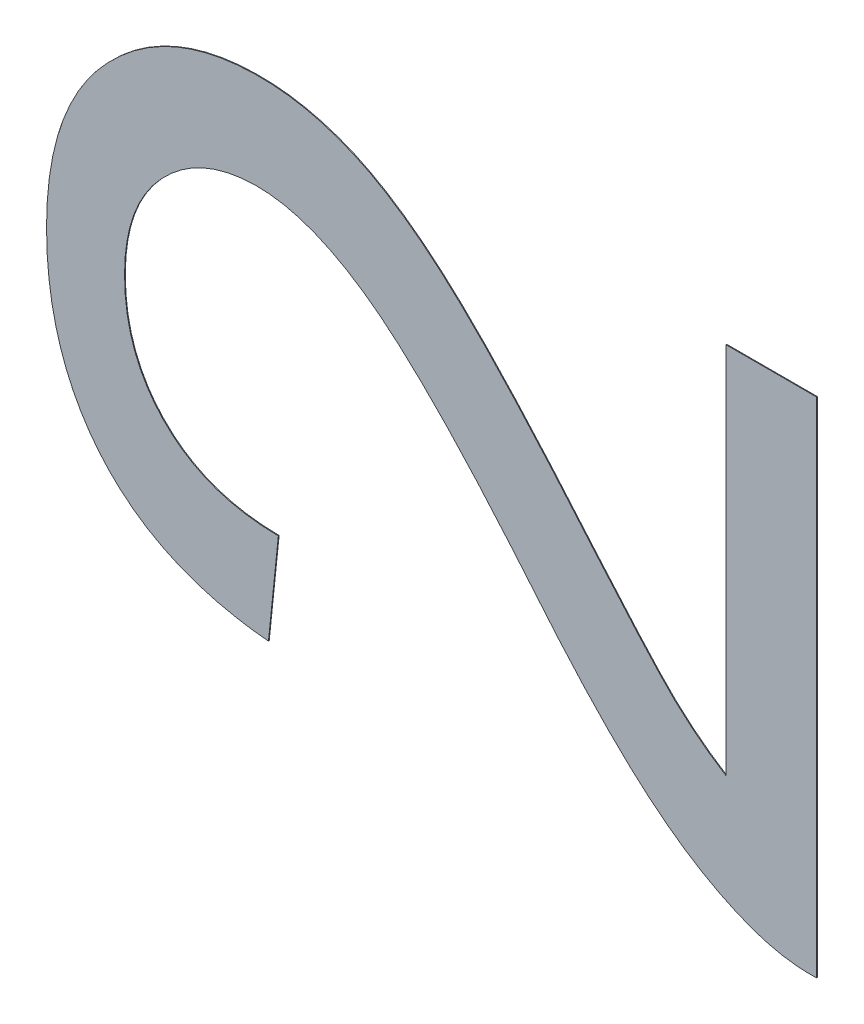
ISO-10303-21;
HEADER;
FILE_DESCRIPTION(('STEP AP214'),'2;1');
FILE_NAME('part.step','',(''),(''),'','','');
FILE_SCHEMA(('AUTOMOTIVE_DESIGN { 1 0 10303 214 1 1 1 1 }'));
ENDSEC;
DATA;
#1=APPLICATION_CONTEXT('core data for automotive mechanical design processes');
#2=APPLICATION_PROTOCOL_DEFINITION('international standard','automotive_design',2000,#1);
#3=PRODUCT_CONTEXT('',#1,'mechanical');
#4=PRODUCT('Part','Part','',(#3));
#5=PRODUCT_RELATED_PRODUCT_CATEGORY('part','',(#4));
#6=PRODUCT_DEFINITION_FORMATION('','',#4);
#7=PRODUCT_DEFINITION_CONTEXT('part definition',#1,'design');
#8=PRODUCT_DEFINITION('design','',#6,#7);
#9=PRODUCT_DEFINITION_SHAPE('','',#8);
#10=(LENGTH_UNIT() NAMED_UNIT(*) SI_UNIT(.MILLI.,.METRE.));
#11=(NAMED_UNIT(*) PLANE_ANGLE_UNIT() SI_UNIT($,.RADIAN.));
#12=(NAMED_UNIT(*) SI_UNIT($,.STERADIAN.) SOLID_ANGLE_UNIT());
#13=UNCERTAINTY_MEASURE_WITH_UNIT(LENGTH_MEASURE(1.E-05),#10,'distance_accuracy_value','');
#14=(GEOMETRIC_REPRESENTATION_CONTEXT(3) GLOBAL_UNCERTAINTY_ASSIGNED_CONTEXT((#13)) GLOBAL_UNIT_ASSIGNED_CONTEXT((#10,
#11,#12)) REPRESENTATION_CONTEXT('',''));
#15=CARTESIAN_POINT('',(0.,0.,0.));
#16=DIRECTION('',(0.,0.,1.));
#17=DIRECTION('',(1.,0.,0.));
#18=AXIS2_PLACEMENT_3D('',#15,#16,#17);
#19=CARTESIAN_POINT('',(51.3,-10.4208269027699,0.002));
#20=DIRECTION('',(0.,-1.,0.));
#21=DIRECTION('',(0.,0.,-1.));
#22=AXIS2_PLACEMENT_3D('',#19,#20,#21);
#23=PLANE('',#22);
#24=CARTESIAN_POINT('',(51.3,-10.4208269027699,0.));
#25=CARTESIAN_POINT('',(51.2212877702749,-10.4208269027699,0.));
#26=CARTESIAN_POINT('',(51.1425755405497,-10.4208269027699,0.));
#27=CARTESIAN_POINT('',(51.0638633108246,-10.4208269027699,0.));
#28=B_SPLINE_CURVE_WITH_KNOTS('',3,(#24,#25,#26,#27),.UNSPECIFIED.,.F.,.F.,(4,4),(0.,
0.0197301457673929),.UNSPECIFIED.);
#29=CARTESIAN_POINT('',(51.3,-10.4208269027699,0.));
#30=VERTEX_POINT('',#29);
#31=CARTESIAN_POINT('',(51.0638633108246,-10.4208269027699,0.));
#32=VERTEX_POINT('',#31);
#33=EDGE_CURVE('E84',#30,#32,#28,.T.);
#34=ORIENTED_EDGE('',*,*,#33,.T.);
#35=DIRECTION('',(0.,0.,-1.));
#36=VECTOR('',#35,1.);
#37=CARTESIAN_POINT('',(51.0638633108246,-10.4208269027699,0.002));
#38=LINE('',#37,#36);
#39=CARTESIAN_POINT('',(51.0638633108246,-10.4208269027699,0.002));
#40=VERTEX_POINT('',#39);
#41=EDGE_CURVE('E93',#40,#32,#38,.T.);
#42=ORIENTED_EDGE('',*,*,#41,.F.);
#43=CARTESIAN_POINT('',(51.3,-10.4208269027699,0.002));
#44=CARTESIAN_POINT('',(51.2212877702749,-10.4208269027699,0.002));
#45=CARTESIAN_POINT('',(51.1425755405497,-10.4208269027699,0.002));
#46=CARTESIAN_POINT('',(51.0638633108246,-10.4208269027699,0.002));
#47=B_SPLINE_CURVE_WITH_KNOTS('',3,(#43,#44,#45,#46),.UNSPECIFIED.,.F.,.F.,(4,4),(0.,
0.0197301457673929),.UNSPECIFIED.);
#48=CARTESIAN_POINT('',(51.3,-10.4208269027699,0.002));
#49=VERTEX_POINT('',#48);
#50=EDGE_CURVE('E98',#49,#40,#47,.T.);
#51=ORIENTED_EDGE('',*,*,#50,.F.);
#52=DIRECTION('',(0.,0.,-1.));
#53=VECTOR('',#52,1.);
#54=CARTESIAN_POINT('',(51.3,-10.4208269027699,0.002));
#55=LINE('',#54,#53);
#56=EDGE_CURVE('E90',#49,#30,#55,.T.);
#57=ORIENTED_EDGE('',*,*,#56,.T.);
#58=EDGE_LOOP('',(#34,#42,#51,#57));
#59=FACE_BOUND('',#58,.T.);
#60=ADVANCED_FACE('F17',(#59),#23,.F.);
#61=CARTESIAN_POINT('',(51.0638633108246,-10.4208269027699,0.002));
#62=DIRECTION('',(1.,0.,0.));
#63=DIRECTION('',(0.,0.,-1.));
#64=AXIS2_PLACEMENT_3D('',#61,#62,#63);
#65=PLANE('',#64);
#66=CARTESIAN_POINT('',(51.0638633108246,-10.4208269027699,0.));
#67=CARTESIAN_POINT('',(51.0638633108246,-10.7453334416376,0.));
#68=CARTESIAN_POINT('',(51.0638633108246,-11.0698399805053,0.));
#69=CARTESIAN_POINT('',(51.0638633108246,-11.394346519373,0.));
#70=B_SPLINE_CURVE_WITH_KNOTS('',3,(#66,#67,#68,#69),.UNSPECIFIED.,.F.,.F.,(4,4),
(0.0197301457673929,0.10107152484805),.UNSPECIFIED.);
#71=CARTESIAN_POINT('',(51.0638633108246,-11.394346519373,0.));
#72=VERTEX_POINT('',#71);
#73=EDGE_CURVE('E81',#32,#72,#70,.T.);
#74=ORIENTED_EDGE('',*,*,#73,.T.);
#75=DIRECTION('',(0.,0.,-1.));
#76=VECTOR('',#75,1.);
#77=CARTESIAN_POINT('',(51.0638633108246,-11.394346519373,0.002));
#78=LINE('',#77,#76);
#79=CARTESIAN_POINT('',(51.0638633108246,-11.394346519373,0.002));
#80=VERTEX_POINT('',#79);
#81=EDGE_CURVE('E89',#80,#72,#78,.T.);
#82=ORIENTED_EDGE('',*,*,#81,.F.);
#83=CARTESIAN_POINT('',(51.0638633108246,-10.4208269027699,0.002));
#84=CARTESIAN_POINT('',(51.0638633108246,-10.7453334416376,0.002));
#85=CARTESIAN_POINT('',(51.0638633108246,-11.0698399805053,0.002));
#86=CARTESIAN_POINT('',(51.0638633108246,-11.394346519373,0.002));
#87=B_SPLINE_CURVE_WITH_KNOTS('',3,(#83,#84,#85,#86),.UNSPECIFIED.,.F.,.F.,(4,4),
(0.0197301457673929,0.10107152484805),.UNSPECIFIED.);
#88=EDGE_CURVE('E75',#40,#80,#87,.T.);
#89=ORIENTED_EDGE('',*,*,#88,.F.);
#90=ORIENTED_EDGE('',*,*,#41,.T.);
#91=EDGE_LOOP('',(#74,#82,#89,#90));
#92=FACE_BOUND('',#91,.T.);
#93=ADVANCED_FACE('F94',(#92),#65,.F.);
#94=CARTESIAN_POINT('',(51.0638633108246,-11.394346519373,0.002));
#95=CARTESIAN_POINT('',(51.019664415797,-11.3671350824466,0.002));
#96=CARTESIAN_POINT('',(50.9750562717413,-11.3330192510763,0.002));
#97=CARTESIAN_POINT('',(50.9308573767137,-11.2915928844124,0.002));
#98=B_SPLINE_CURVE_WITH_KNOTS('',3,(#94,#95,#96,#97),.UNSPECIFIED.,.F.,.F.,(4,4),
(0.10107152484805,0.115138394089632),.UNSPECIFIED.);
#99=DIRECTION('',(0.,0.,-1.));
#100=VECTOR('',#99,1.);
#101=SURFACE_OF_LINEAR_EXTRUSION('',#98,#100);
#102=CARTESIAN_POINT('',(51.0638633108246,-11.394346519373,0.));
#103=CARTESIAN_POINT('',(51.019664415797,-11.3671350824466,0.));
#104=CARTESIAN_POINT('',(50.9750562717413,-11.3330192510763,0.));
#105=CARTESIAN_POINT('',(50.9308573767137,-11.2915928844124,0.));
#106=B_SPLINE_CURVE_WITH_KNOTS('',3,(#102,#103,#104,#105),.UNSPECIFIED.,.F.,.F.,(4,4),
(0.10107152484805,0.115138394089632),.UNSPECIFIED.);
#107=CARTESIAN_POINT('',(50.9308573767137,-11.2915928844124,0.));
#108=VERTEX_POINT('',#107);
#109=EDGE_CURVE('E86',#72,#108,#106,.T.);
#110=ORIENTED_EDGE('',*,*,#109,.T.);
#111=DIRECTION('',(0.,0.,-1.));
#112=VECTOR('',#111,1.);
#113=CARTESIAN_POINT('',(50.9308573767137,-11.2915928844124,0.002));
#114=LINE('',#113,#112);
#115=CARTESIAN_POINT('',(50.9308573767137,-11.2915928844124,0.002));
#116=VERTEX_POINT('',#115);
#117=EDGE_CURVE('E145',#116,#108,#114,.T.);
#118=ORIENTED_EDGE('',*,*,#117,.F.);
#119=EDGE_CURVE('E149',#80,#116,#98,.T.);
#120=ORIENTED_EDGE('',*,*,#119,.F.);
#121=ORIENTED_EDGE('',*,*,#81,.T.);
#122=EDGE_LOOP('',(#110,#118,#120,#121));
#123=FACE_BOUND('',#122,.T.);
#124=ADVANCED_FACE('F171',(#123),#101,.F.);
#125=CARTESIAN_POINT('',(50.9308573767137,-11.2915928844124,0.002));
#126=CARTESIAN_POINT('',(50.8870677307141,-11.2497603768988,0.002));
#127=CARTESIAN_POINT('',(50.8031716799672,-11.1559418406304,0.002));
#128=CARTESIAN_POINT('',(50.5304979260244,-10.8344335134115,0.002));
#129=CARTESIAN_POINT('',(50.4127481072232,-10.7095930468687,0.002));
#130=CARTESIAN_POINT('',(50.2418832223635,-10.5586863570783,0.002));
#131=CARTESIAN_POINT('',(50.1606507059546,-10.5048980586468,0.002));
#132=CARTESIAN_POINT('',(50.0059545733579,-10.4399155227033,0.002));
#133=CARTESIAN_POINT('',(49.9273787599754,-10.4236698887175,0.002));
#134=CARTESIAN_POINT('',(49.6896050746879,-10.4236698887175,0.002));
#135=CARTESIAN_POINT('',(49.5578268876611,-10.4789050442694,0.002));
#136=CARTESIAN_POINT('',(49.3452200825439,-10.7012582486509,0.002));
#137=CARTESIAN_POINT('',(49.2918150194393,-10.851742344245,0.002));
#138=CARTESIAN_POINT('',(49.2918150194393,-11.231077897815,0.002));
#139=CARTESIAN_POINT('',(49.3413341518314,-11.3813500121843,0.002));
#140=CARTESIAN_POINT('',(49.5387938539817,-11.6049558538483,0.002));
#141=CARTESIAN_POINT('',(49.6822385921833,-11.6697100154334,0.002));
#142=CARTESIAN_POINT('',(49.8704931450788,-11.6867679311186,0.002));
#143=B_SPLINE_CURVE_WITH_KNOTS('',3,(#125,#126,#127,#128,#129,#130,#131,#132,#133,#134,#135,
#136,#137,#138,#139,#140,#141,#142),.UNSPECIFIED.,.F.,.F.,(4,2,2,2,2,2,2,2,4),
(0.115138394089632,0.146721034798765,0.184586673700444,0.222363237066393,0.260139800432342,
0.334343764186879,0.408406377468413,0.481837326670786,0.555418423030882),.UNSPECIFIED.);
#144=DIRECTION('',(0.,0.,-1.));
#145=VECTOR('',#144,1.);
#146=SURFACE_OF_LINEAR_EXTRUSION('',#143,#145);
#147=CARTESIAN_POINT('',(50.9308573767137,-11.2915928844124,0.));
#148=CARTESIAN_POINT('',(50.8870677307141,-11.2497603768988,0.));
#149=CARTESIAN_POINT('',(50.8031716799672,-11.1559418406304,0.));
#150=CARTESIAN_POINT('',(50.5304979260244,-10.8344335134115,0.));
#151=CARTESIAN_POINT('',(50.4127481072232,-10.7095930468687,0.));
#152=CARTESIAN_POINT('',(50.2418832223635,-10.5586863570783,0.));
#153=CARTESIAN_POINT('',(50.1606507059546,-10.5048980586468,0.));
#154=CARTESIAN_POINT('',(50.0059545733579,-10.4399155227033,0.));
#155=CARTESIAN_POINT('',(49.9273787599754,-10.4236698887175,0.));
#156=CARTESIAN_POINT('',(49.6896050746879,-10.4236698887175,0.));
#157=CARTESIAN_POINT('',(49.5578268876611,-10.4789050442694,0.));
#158=CARTESIAN_POINT('',(49.3452200825439,-10.7012582486509,0.));
#159=CARTESIAN_POINT('',(49.2918150194393,-10.851742344245,0.));
#160=CARTESIAN_POINT('',(49.2918150194393,-11.231077897815,0.));
#161=CARTESIAN_POINT('',(49.3413341518314,-11.3813500121843,0.));
#162=CARTESIAN_POINT('',(49.5387938539817,-11.6049558538483,0.));
#163=CARTESIAN_POINT('',(49.6822385921833,-11.6697100154334,0.));
#164=CARTESIAN_POINT('',(49.8704931450788,-11.6867679311186,0.));
#165=B_SPLINE_CURVE_WITH_KNOTS('',3,(#147,#148,#149,#150,#151,#152,#153,#154,#155,#156,#157,
#158,#159,#160,#161,#162,#163,#164),.UNSPECIFIED.,.F.,.F.,(4,2,2,2,2,2,2,2,4),
(0.115138394089632,0.146721034798765,0.184586673700444,0.222363237066393,0.260139800432342,
0.334343764186879,0.408406377468413,0.481837326670786,0.555418423030882),.UNSPECIFIED.);
#166=CARTESIAN_POINT('',(49.8704931450788,-11.6867679311186,0.));
#167=VERTEX_POINT('',#166);
#168=EDGE_CURVE('E153',#108,#167,#165,.T.);
#169=ORIENTED_EDGE('',*,*,#168,.T.);
#170=DIRECTION('',(0.,0.,-1.));
#171=VECTOR('',#170,1.);
#172=CARTESIAN_POINT('',(49.8704931450788,-11.6867679311186,0.002));
#173=LINE('',#172,#171);
#174=CARTESIAN_POINT('',(49.8704931450788,-11.6867679311186,0.002));
#175=VERTEX_POINT('',#174);
#176=EDGE_CURVE('E247',#175,#167,#173,.T.);
#177=ORIENTED_EDGE('',*,*,#176,.F.);
#178=EDGE_CURVE('E237',#116,#175,#143,.T.);
#179=ORIENTED_EDGE('',*,*,#178,.F.);
#180=ORIENTED_EDGE('',*,*,#117,.T.);
#181=EDGE_LOOP('',(#169,#177,#179,#180));
#182=FACE_BOUND('',#181,.T.);
#183=ADVANCED_FACE('F175',(#182),#146,.F.);
#184=CARTESIAN_POINT('',(49.8704931450788,-11.6867679311186,0.002));
#185=DIRECTION('',(-0.994748646277284,0.102348086105754,0.));
#186=DIRECTION('',(-0.102348086105754,-0.994748646277284,0.));
#187=AXIS2_PLACEMENT_3D('',#184,#185,#186);
#188=PLANE('',#187);
#189=CARTESIAN_POINT('',(49.8704931450788,-11.6867679311186,0.));
#190=CARTESIAN_POINT('',(49.8790873746675,-11.6032382963746,0.));
#191=CARTESIAN_POINT('',(49.8876816042562,-11.5197086616306,0.));
#192=CARTESIAN_POINT('',(49.8962758338449,-11.4361790268866,0.));
#193=B_SPLINE_CURVE_WITH_KNOTS('',3,(#189,#190,#191,#192),.UNSPECIFIED.,.F.,.F.,(4,4),
(0.555418423030882,0.585117762879457),.UNSPECIFIED.);
#194=CARTESIAN_POINT('',(49.8962758338449,-11.4361790268866,0.));
#195=VERTEX_POINT('',#194);
#196=EDGE_CURVE('E234',#167,#195,#193,.T.);
#197=ORIENTED_EDGE('',*,*,#196,.T.);
#198=DIRECTION('',(0.,0.,-1.));
#199=VECTOR('',#198,1.);
#200=CARTESIAN_POINT('',(49.8962758338449,-11.4361790268866,0.002));
#201=LINE('',#200,#199);
#202=CARTESIAN_POINT('',(49.8962758338449,-11.4361790268866,0.002));
#203=VERTEX_POINT('',#202);
#204=EDGE_CURVE('E223',#203,#195,#201,.T.);
#205=ORIENTED_EDGE('',*,*,#204,.F.);
#206=CARTESIAN_POINT('',(49.8704931450788,-11.6867679311186,0.002));
#207=CARTESIAN_POINT('',(49.8790873746675,-11.6032382963746,0.002));
#208=CARTESIAN_POINT('',(49.8876816042562,-11.5197086616306,0.002));
#209=CARTESIAN_POINT('',(49.8962758338449,-11.4361790268866,0.002));
#210=B_SPLINE_CURVE_WITH_KNOTS('',3,(#206,#207,#208,#209),.UNSPECIFIED.,.F.,.F.,(4,4),
(0.555418423030882,0.585117762879457),.UNSPECIFIED.);
#211=EDGE_CURVE('E213',#175,#203,#210,.T.);
#212=ORIENTED_EDGE('',*,*,#211,.F.);
#213=ORIENTED_EDGE('',*,*,#176,.T.);
#214=EDGE_LOOP('',(#197,#205,#212,#213));
#215=FACE_BOUND('',#214,.T.);
#216=ADVANCED_FACE('F180',(#215),#188,.F.);
#217=CARTESIAN_POINT('',(49.8962758338449,-11.4361790268866,0.002));
#218=CARTESIAN_POINT('',(49.7706363822386,-11.4353667451873,0.002));
#219=CARTESIAN_POINT('',(49.6724166155105,-11.3996263504184,0.002));
#220=CARTESIAN_POINT('',(49.5308164518109,-11.2591016164406,0.002));
#221=CARTESIAN_POINT('',(49.495211786372,-11.1648769393226,0.002));
#222=CARTESIAN_POINT('',(49.495211786372,-10.9366257818212,0.002));
#223=CARTESIAN_POINT('',(49.5287702066707,-10.8468686540493,0.002));
#224=CARTESIAN_POINT('',(49.6621853898097,-10.7087807651694,0.002));
#225=CARTESIAN_POINT('',(49.7444444444444,-10.6742587929494,0.002));
#226=CARTESIAN_POINT('',(49.934335993452,-10.6742587929494,0.002));
#227=CARTESIAN_POINT('',(50.0329650092081,-10.7120298919666,0.002));
#228=CARTESIAN_POINT('',(50.2409378847106,-10.8639809060736,0.002));
#229=CARTESIAN_POINT('',(50.3824636791488,-11.0093249939079,0.002));
#230=CARTESIAN_POINT('',(50.6751179927537,-11.3638519079013,0.002));
#231=CARTESIAN_POINT('',(50.776161244117,-11.4702948582569,0.002));
#232=CARTESIAN_POINT('',(50.9507407254438,-11.6175197306935,0.002));
#233=CARTESIAN_POINT('',(51.0393083691426,-11.6709284379823,0.002));
#234=CARTESIAN_POINT('',(51.1843231730134,-11.7245689021777,0.002));
#235=CARTESIAN_POINT('',(51.2410681399632,-11.7346925513769,0.002));
#236=CARTESIAN_POINT('',(51.3,-11.7326618471286,0.002));
#237=B_SPLINE_CURVE_WITH_KNOTS('',3,(#217,#218,#219,#220,#221,#222,#223,#224,#225,#226,#227,
#228,#229,#230,#231,#232,#233,#234,#235,#236),.UNSPECIFIED.,.F.,.F.,(4,2,2,2,2,2,2,2,2,4),
(0.585117762879457,0.623050081460113,0.66098240004077,0.697070786468202,0.733159172895635,
0.767427976814123,0.801721297942334,0.823803107613923,0.84594556063426,0.859466917332896),.UNSPECIFIED.);
#238=DIRECTION('',(0.,0.,-1.));
#239=VECTOR('',#238,1.);
#240=SURFACE_OF_LINEAR_EXTRUSION('',#237,#239);
#241=CARTESIAN_POINT('',(49.8962758338449,-11.4361790268866,0.));
#242=CARTESIAN_POINT('',(49.7706363822386,-11.4353667451873,0.));
#243=CARTESIAN_POINT('',(49.6724166155105,-11.3996263504184,0.));
#244=CARTESIAN_POINT('',(49.5308164518109,-11.2591016164406,0.));
#245=CARTESIAN_POINT('',(49.495211786372,-11.1648769393226,0.));
#246=CARTESIAN_POINT('',(49.495211786372,-10.9366257818212,0.));
#247=CARTESIAN_POINT('',(49.5287702066707,-10.8468686540493,0.));
#248=CARTESIAN_POINT('',(49.6621853898097,-10.7087807651694,0.));
#249=CARTESIAN_POINT('',(49.7444444444444,-10.6742587929494,0.));
#250=CARTESIAN_POINT('',(49.934335993452,-10.6742587929494,0.));
#251=CARTESIAN_POINT('',(50.0329650092081,-10.7120298919666,0.));
#252=CARTESIAN_POINT('',(50.2409378847106,-10.8639809060736,0.));
#253=CARTESIAN_POINT('',(50.3824636791488,-11.0093249939079,0.));
#254=CARTESIAN_POINT('',(50.6751179927537,-11.3638519079013,0.));
#255=CARTESIAN_POINT('',(50.776161244117,-11.4702948582569,0.));
#256=CARTESIAN_POINT('',(50.9507407254438,-11.6175197306935,0.));
#257=CARTESIAN_POINT('',(51.0393083691426,-11.6709284379823,0.));
#258=CARTESIAN_POINT('',(51.1843231730134,-11.7245689021777,0.));
#259=CARTESIAN_POINT('',(51.2410681399632,-11.7346925513769,0.));
#260=CARTESIAN_POINT('',(51.3,-11.7326618471286,0.));
#261=B_SPLINE_CURVE_WITH_KNOTS('',3,(#241,#242,#243,#244,#245,#246,#247,#248,#249,#250,#251,
#252,#253,#254,#255,#256,#257,#258,#259,#260),.UNSPECIFIED.,.F.,.F.,(4,2,2,2,2,2,2,2,2,4),
(0.585117762879457,0.623050081460113,0.66098240004077,0.697070786468202,0.733159172895635,
0.767427976814123,0.801721297942334,0.823803107613923,0.84594556063426,0.859466917332896),.UNSPECIFIED.);
#262=CARTESIAN_POINT('',(51.3,-11.7326618471286,0.));
#263=VERTEX_POINT('',#262);
#264=EDGE_CURVE('E210',#195,#263,#261,.T.);
#265=ORIENTED_EDGE('',*,*,#264,.T.);
#266=DIRECTION('',(0.,0.,-1.));
#267=VECTOR('',#266,1.);
#268=CARTESIAN_POINT('',(51.3,-11.7326618471286,0.002));
#269=LINE('',#268,#267);
#270=CARTESIAN_POINT('',(51.3,-11.7326618471286,0.002));
#271=VERTEX_POINT('',#270);
#272=EDGE_CURVE('E202',#271,#263,#269,.T.);
#273=ORIENTED_EDGE('',*,*,#272,.F.);
#274=EDGE_CURVE('E38',#203,#271,#237,.T.);
#275=ORIENTED_EDGE('',*,*,#274,.F.);
#276=ORIENTED_EDGE('',*,*,#204,.T.);
#277=EDGE_LOOP('',(#265,#273,#275,#276));
#278=FACE_BOUND('',#277,.T.);
#279=ADVANCED_FACE('F184',(#278),#240,.F.);
#280=CARTESIAN_POINT('',(51.3,-11.7326618471286,0.002));
#281=DIRECTION('',(-1.,0.,0.));
#282=DIRECTION('',(0.,0.,1.));
#283=AXIS2_PLACEMENT_3D('',#280,#281,#282);
#284=PLANE('',#283);
#285=CARTESIAN_POINT('',(51.3,-11.7326618471286,0.));
#286=CARTESIAN_POINT('',(51.3,-11.2953835323424,0.));
#287=CARTESIAN_POINT('',(51.3,-10.8581052175562,0.));
#288=CARTESIAN_POINT('',(51.3,-10.4208269027699,0.));
#289=B_SPLINE_CURVE_WITH_KNOTS('',3,(#285,#286,#287,#288),.UNSPECIFIED.,.F.,.F.,(4,4),
(0.859466917332896,1.),.UNSPECIFIED.);
#290=EDGE_CURVE('E30',#263,#30,#289,.T.);
#291=ORIENTED_EDGE('',*,*,#290,.T.);
#292=ORIENTED_EDGE('',*,*,#56,.F.);
#293=CARTESIAN_POINT('',(51.3,-11.7326618471286,0.002));
#294=CARTESIAN_POINT('',(51.3,-11.2953835323424,0.002));
#295=CARTESIAN_POINT('',(51.3,-10.8581052175562,0.002));
#296=CARTESIAN_POINT('',(51.3,-10.4208269027699,0.002));
#297=B_SPLINE_CURVE_WITH_KNOTS('',3,(#293,#294,#295,#296),.UNSPECIFIED.,.F.,.F.,(4,4),
(0.859466917332896,1.),.UNSPECIFIED.);
#298=EDGE_CURVE('E11',#271,#49,#297,.T.);
#299=ORIENTED_EDGE('',*,*,#298,.F.);
#300=ORIENTED_EDGE('',*,*,#272,.T.);
#301=EDGE_LOOP('',(#291,#292,#299,#300));
#302=FACE_BOUND('',#301,.T.);
#303=ADVANCED_FACE('F188',(#302),#284,.F.);
#304=CARTESIAN_POINT('',(50.9973603437692,-11.3483003005443,0.002));
#305=DIRECTION('',(0.,0.,1.));
#306=DIRECTION('',(1.,0.,0.));
#307=AXIS2_PLACEMENT_3D('',#304,#305,#306);
#308=PLANE('',#307);
#309=ORIENTED_EDGE('',*,*,#50,.T.);
#310=ORIENTED_EDGE('',*,*,#88,.T.);
#311=ORIENTED_EDGE('',*,*,#119,.T.);
#312=ORIENTED_EDGE('',*,*,#178,.T.);
#313=ORIENTED_EDGE('',*,*,#211,.T.);
#314=ORIENTED_EDGE('',*,*,#274,.T.);
#315=ORIENTED_EDGE('',*,*,#298,.T.);
#316=EDGE_LOOP('',(#309,#310,#311,#312,#313,#314,#315));
#317=FACE_BOUND('',#316,.T.);
#318=ADVANCED_FACE('F262',(#317),#308,.T.);
#319=CARTESIAN_POINT('',(50.9973603437692,-11.3483003005443,0.));
#320=DIRECTION('',(0.,0.,1.));
#321=DIRECTION('',(1.,0.,0.));
#322=AXIS2_PLACEMENT_3D('',#319,#320,#321);
#323=PLANE('',#322);
#324=ORIENTED_EDGE('',*,*,#33,.F.);
#325=ORIENTED_EDGE('',*,*,#290,.F.);
#326=ORIENTED_EDGE('',*,*,#264,.F.);
#327=ORIENTED_EDGE('',*,*,#196,.F.);
#328=ORIENTED_EDGE('',*,*,#168,.F.);
#329=ORIENTED_EDGE('',*,*,#109,.F.);
#330=ORIENTED_EDGE('',*,*,#73,.F.);
#331=EDGE_LOOP('',(#324,#325,#326,#327,#328,#329,#330));
#332=FACE_BOUND('',#331,.T.);
#333=ADVANCED_FACE('F19',(#332),#323,.F.);
#334=CLOSED_SHELL('',(#60,#93,#124,#183,#216,#279,#303,#318,#333));
#335=MANIFOLD_SOLID_BREP('B1',#334);
#336=ADVANCED_BREP_SHAPE_REPRESENTATION('',(#18,#335),#14);
#337=SHAPE_DEFINITION_REPRESENTATION(#9,#336);
ENDSEC;
END-ISO-10303-21;
